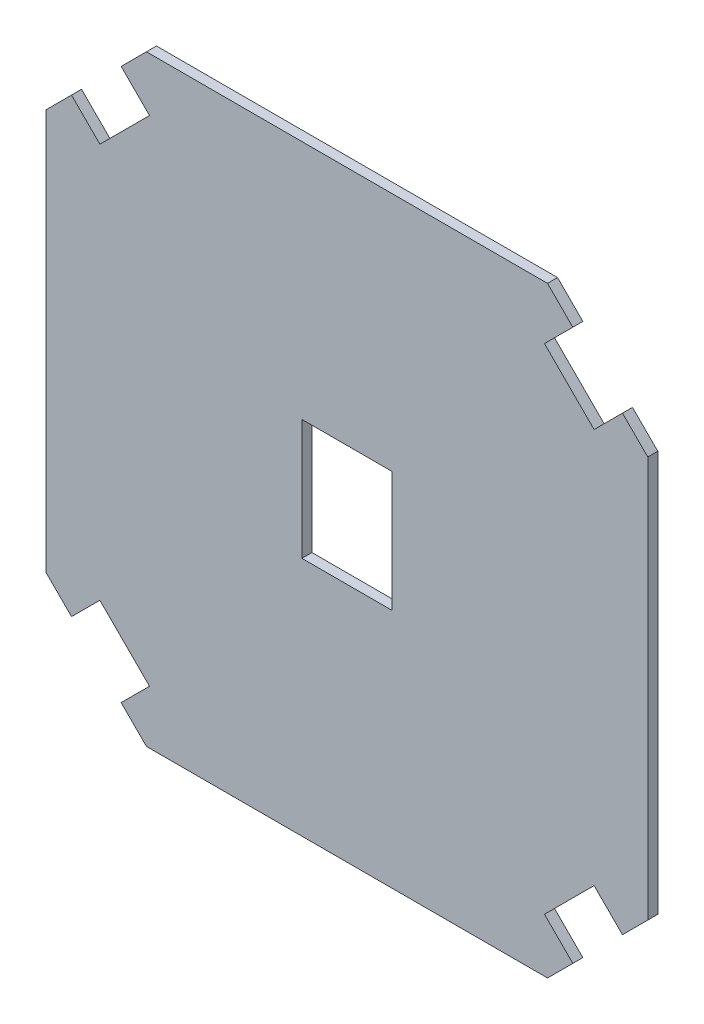
ISO-10303-21;
HEADER;
FILE_DESCRIPTION(('STEP AP214'),'2;1');
FILE_NAME('part.step','',(''),(''),'','','');
FILE_SCHEMA(('AUTOMOTIVE_DESIGN { 1 0 10303 214 1 1 1 1 }'));
ENDSEC;
DATA;
#1=APPLICATION_CONTEXT('core data for automotive mechanical design processes');
#2=APPLICATION_PROTOCOL_DEFINITION('international standard','automotive_design',2000,#1);
#3=PRODUCT_CONTEXT('',#1,'mechanical');
#4=PRODUCT('Part','Part','',(#3));
#5=PRODUCT_RELATED_PRODUCT_CATEGORY('part','',(#4));
#6=PRODUCT_DEFINITION_FORMATION('','',#4);
#7=PRODUCT_DEFINITION_CONTEXT('part definition',#1,'design');
#8=PRODUCT_DEFINITION('design','',#6,#7);
#9=PRODUCT_DEFINITION_SHAPE('','',#8);
#10=(LENGTH_UNIT() NAMED_UNIT(*) SI_UNIT(.MILLI.,.METRE.));
#11=(NAMED_UNIT(*) PLANE_ANGLE_UNIT() SI_UNIT($,.RADIAN.));
#12=(NAMED_UNIT(*) SI_UNIT($,.STERADIAN.) SOLID_ANGLE_UNIT());
#13=UNCERTAINTY_MEASURE_WITH_UNIT(LENGTH_MEASURE(1.E-05),#10,'distance_accuracy_value','');
#14=(GEOMETRIC_REPRESENTATION_CONTEXT(3) GLOBAL_UNCERTAINTY_ASSIGNED_CONTEXT((#13)) GLOBAL_UNIT_ASSIGNED_CONTEXT((#10,
#11,#12)) REPRESENTATION_CONTEXT('',''));
#15=CARTESIAN_POINT('',(0.,0.,0.));
#16=DIRECTION('',(0.,0.,1.));
#17=DIRECTION('',(1.,0.,0.));
#18=AXIS2_PLACEMENT_3D('',#15,#16,#17);
#19=CARTESIAN_POINT('',(0.,-30.,5.));
#20=DIRECTION('',(0.,-1.,0.));
#21=DIRECTION('',(1.,0.,0.));
#22=AXIS2_PLACEMENT_3D('',#19,#20,#21);
#23=PLANE('',#22);
#24=DIRECTION('',(-1.,0.,0.));
#25=VECTOR('',#24,1.);
#26=CARTESIAN_POINT('',(0.,-30.,0.));
#27=LINE('',#26,#25);
#28=CARTESIAN_POINT('',(22.5,-30.,0.));
#29=VERTEX_POINT('',#28);
#30=CARTESIAN_POINT('',(-22.5,-30.,0.));
#31=VERTEX_POINT('',#30);
#32=EDGE_CURVE('E340',#29,#31,#27,.T.);
#33=ORIENTED_EDGE('',*,*,#32,.T.);
#34=DIRECTION('',(0.,0.,-1.));
#35=VECTOR('',#34,1.);
#36=CARTESIAN_POINT('',(-22.5,-30.,5.));
#37=LINE('',#36,#35);
#38=CARTESIAN_POINT('',(-22.5,-30.,5.));
#39=VERTEX_POINT('',#38);
#40=EDGE_CURVE('E11',#39,#31,#37,.T.);
#41=ORIENTED_EDGE('',*,*,#40,.F.);
#42=DIRECTION('',(-1.,0.,0.));
#43=VECTOR('',#42,1.);
#44=CARTESIAN_POINT('',(0.,-30.,5.));
#45=LINE('',#44,#43);
#46=CARTESIAN_POINT('',(22.5,-30.,5.));
#47=VERTEX_POINT('',#46);
#48=EDGE_CURVE('E241',#47,#39,#45,.T.);
#49=ORIENTED_EDGE('',*,*,#48,.F.);
#50=DIRECTION('',(0.,0.,-1.));
#51=VECTOR('',#50,1.);
#52=CARTESIAN_POINT('',(22.5,-30.,5.));
#53=LINE('',#52,#51);
#54=EDGE_CURVE('E61',#47,#29,#53,.T.);
#55=ORIENTED_EDGE('',*,*,#54,.T.);
#56=EDGE_LOOP('',(#33,#41,#49,#55));
#57=FACE_BOUND('',#56,.T.);
#58=ADVANCED_FACE('F41',(#57),#23,.F.);
#59=CARTESIAN_POINT('',(-22.5,0.,5.));
#60=DIRECTION('',(-1.,0.,0.));
#61=DIRECTION('',(0.,0.,1.));
#62=AXIS2_PLACEMENT_3D('',#59,#60,#61);
#63=PLANE('',#62);
#64=DIRECTION('',(0.,1.,0.));
#65=VECTOR('',#64,1.);
#66=CARTESIAN_POINT('',(-22.5,0.,0.));
#67=LINE('',#66,#65);
#68=CARTESIAN_POINT('',(-22.5,30.,0.));
#69=VERTEX_POINT('',#68);
#70=EDGE_CURVE('E248',#31,#69,#67,.T.);
#71=ORIENTED_EDGE('',*,*,#70,.T.);
#72=DIRECTION('',(0.,0.,-1.));
#73=VECTOR('',#72,1.);
#74=CARTESIAN_POINT('',(-22.5,30.,5.));
#75=LINE('',#74,#73);
#76=CARTESIAN_POINT('',(-22.5,30.,5.));
#77=VERTEX_POINT('',#76);
#78=EDGE_CURVE('E52',#77,#69,#75,.T.);
#79=ORIENTED_EDGE('',*,*,#78,.F.);
#80=DIRECTION('',(0.,1.,0.));
#81=VECTOR('',#80,1.);
#82=CARTESIAN_POINT('',(-22.5,0.,5.));
#83=LINE('',#82,#81);
#84=EDGE_CURVE('E235',#39,#77,#83,.T.);
#85=ORIENTED_EDGE('',*,*,#84,.F.);
#86=ORIENTED_EDGE('',*,*,#40,.T.);
#87=EDGE_LOOP('',(#71,#79,#85,#86));
#88=FACE_BOUND('',#87,.T.);
#89=ADVANCED_FACE('F247',(#88),#63,.F.);
#90=CARTESIAN_POINT('',(0.,30.,5.));
#91=DIRECTION('',(0.,-1.,0.));
#92=DIRECTION('',(1.,0.,0.));
#93=AXIS2_PLACEMENT_3D('',#90,#91,#92);
#94=PLANE('',#93);
#95=DIRECTION('',(-1.,0.,0.));
#96=VECTOR('',#95,1.);
#97=CARTESIAN_POINT('',(0.,30.,0.));
#98=LINE('',#97,#96);
#99=CARTESIAN_POINT('',(22.5,30.,0.));
#100=VERTEX_POINT('',#99);
#101=EDGE_CURVE('E345',#100,#69,#98,.T.);
#102=ORIENTED_EDGE('',*,*,#101,.F.);
#103=DIRECTION('',(0.,0.,-1.));
#104=VECTOR('',#103,1.);
#105=CARTESIAN_POINT('',(22.5,30.,5.));
#106=LINE('',#105,#104);
#107=CARTESIAN_POINT('',(22.5,30.,5.));
#108=VERTEX_POINT('',#107);
#109=EDGE_CURVE('E147',#108,#100,#106,.T.);
#110=ORIENTED_EDGE('',*,*,#109,.F.);
#111=DIRECTION('',(-1.,0.,0.));
#112=VECTOR('',#111,1.);
#113=CARTESIAN_POINT('',(0.,30.,5.));
#114=LINE('',#113,#112);
#115=EDGE_CURVE('E240',#108,#77,#114,.T.);
#116=ORIENTED_EDGE('',*,*,#115,.T.);
#117=ORIENTED_EDGE('',*,*,#78,.T.);
#118=EDGE_LOOP('',(#102,#110,#116,#117));
#119=FACE_BOUND('',#118,.T.);
#120=ADVANCED_FACE('F253',(#119),#94,.T.);
#121=CARTESIAN_POINT('',(110.857864376269,-110.85786437627,5.));
#122=DIRECTION('',(0.707106781186543,-0.707106781186552,0.));
#123=DIRECTION('',(0.707106781186552,0.707106781186543,0.));
#124=AXIS2_PLACEMENT_3D('',#121,#122,#123);
#125=PLANE('',#124);
#126=DIRECTION('',(-0.707106781186552,-0.707106781186543,0.));
#127=VECTOR('',#126,1.);
#128=CARTESIAN_POINT('',(110.857864376269,-110.85786437627,0.));
#129=LINE('',#128,#127);
#130=CARTESIAN_POINT('',(123.232233047034,-98.4834957055048,0.));
#131=VERTEX_POINT('',#130);
#132=CARTESIAN_POINT('',(98.4834957055044,-123.232233047034,0.));
#133=VERTEX_POINT('',#132);
#134=EDGE_CURVE('E262',#131,#133,#129,.T.);
#135=ORIENTED_EDGE('',*,*,#134,.F.);
#136=DIRECTION('',(0.,0.,-1.));
#137=VECTOR('',#136,1.);
#138=CARTESIAN_POINT('',(123.232233047034,-98.4834957055048,5.));
#139=LINE('',#138,#137);
#140=CARTESIAN_POINT('',(123.232233047034,-98.4834957055048,5.));
#141=VERTEX_POINT('',#140);
#142=EDGE_CURVE('E45',#141,#131,#139,.T.);
#143=ORIENTED_EDGE('',*,*,#142,.F.);
#144=DIRECTION('',(-0.707106781186552,-0.707106781186543,0.));
#145=VECTOR('',#144,1.);
#146=CARTESIAN_POINT('',(110.857864376269,-110.85786437627,5.));
#147=LINE('',#146,#145);
#148=CARTESIAN_POINT('',(98.4834957055044,-123.232233047034,5.));
#149=VERTEX_POINT('',#148);
#150=EDGE_CURVE('E352',#141,#149,#147,.T.);
#151=ORIENTED_EDGE('',*,*,#150,.T.);
#152=DIRECTION('',(0.,0.,-1.));
#153=VECTOR('',#152,1.);
#154=CARTESIAN_POINT('',(98.4834957055044,-123.232233047034,5.));
#155=LINE('',#154,#153);
#156=EDGE_CURVE('E258',#149,#133,#155,.T.);
#157=ORIENTED_EDGE('',*,*,#156,.T.);
#158=EDGE_LOOP('',(#135,#143,#151,#157));
#159=FACE_BOUND('',#158,.T.);
#160=ADVANCED_FACE('F43',(#159),#125,.T.);
#161=CARTESIAN_POINT('',(12.3743686707649,12.3743686707648,5.));
#162=DIRECTION('',(-0.70710678118655,-0.707106781186545,0.));
#163=DIRECTION('',(0.707106781186545,-0.70710678118655,0.));
#164=AXIS2_PLACEMENT_3D('',#161,#162,#163);
#165=PLANE('',#164);
#166=DIRECTION('',(-0.707106781186545,0.70710678118655,0.));
#167=VECTOR('',#166,1.);
#168=CARTESIAN_POINT('',(12.3743686707649,12.3743686707648,0.));
#169=LINE('',#168,#167);
#170=CARTESIAN_POINT('',(137.374368670765,-112.625631329236,0.));
#171=VERTEX_POINT('',#170);
#172=EDGE_CURVE('E266',#171,#131,#169,.T.);
#173=ORIENTED_EDGE('',*,*,#172,.F.);
#174=DIRECTION('',(0.,0.,-1.));
#175=VECTOR('',#174,1.);
#176=CARTESIAN_POINT('',(137.374368670765,-112.625631329236,5.));
#177=LINE('',#176,#175);
#178=CARTESIAN_POINT('',(137.374368670765,-112.625631329236,5.));
#179=VERTEX_POINT('',#178);
#180=EDGE_CURVE('E427',#179,#171,#177,.T.);
#181=ORIENTED_EDGE('',*,*,#180,.F.);
#182=DIRECTION('',(-0.707106781186545,0.70710678118655,0.));
#183=VECTOR('',#182,1.);
#184=CARTESIAN_POINT('',(12.3743686707649,12.3743686707648,5.));
#185=LINE('',#184,#183);
#186=EDGE_CURVE('E438',#179,#141,#185,.T.);
#187=ORIENTED_EDGE('',*,*,#186,.T.);
#188=ORIENTED_EDGE('',*,*,#142,.T.);
#189=EDGE_LOOP('',(#173,#181,#187,#188));
#190=FACE_BOUND('',#189,.T.);
#191=ADVANCED_FACE('F436',(#190),#165,.T.);
#192=CARTESIAN_POINT('',(124.999999999999,-125.000000000001,5.));
#193=DIRECTION('',(-0.707106781186544,0.707106781186552,0.));
#194=DIRECTION('',(-0.707106781186551,-0.707106781186544,0.));
#195=AXIS2_PLACEMENT_3D('',#192,#193,#194);
#196=PLANE('',#195);
#197=DIRECTION('',(0.707106781186552,0.707106781186544,0.));
#198=VECTOR('',#197,1.);
#199=CARTESIAN_POINT('',(124.999999999999,-125.000000000001,0.));
#200=LINE('',#199,#198);
#201=CARTESIAN_POINT('',(150.,-100.000000000001,0.));
#202=VERTEX_POINT('',#201);
#203=EDGE_CURVE('E270',#171,#202,#200,.T.);
#204=ORIENTED_EDGE('',*,*,#203,.T.);
#205=DIRECTION('',(0.,0.,-1.));
#206=VECTOR('',#205,1.);
#207=CARTESIAN_POINT('',(150.,-100.000000000001,5.));
#208=LINE('',#207,#206);
#209=CARTESIAN_POINT('',(150.,-100.000000000001,5.));
#210=VERTEX_POINT('',#209);
#211=EDGE_CURVE('E424',#210,#202,#208,.T.);
#212=ORIENTED_EDGE('',*,*,#211,.F.);
#213=DIRECTION('',(0.707106781186552,0.707106781186544,0.));
#214=VECTOR('',#213,1.);
#215=CARTESIAN_POINT('',(124.999999999999,-125.000000000001,5.));
#216=LINE('',#215,#214);
#217=EDGE_CURVE('E456',#179,#210,#216,.T.);
#218=ORIENTED_EDGE('',*,*,#217,.F.);
#219=ORIENTED_EDGE('',*,*,#180,.T.);
#220=EDGE_LOOP('',(#204,#212,#218,#219));
#221=FACE_BOUND('',#220,.T.);
#222=ADVANCED_FACE('F445',(#221),#196,.F.);
#223=CARTESIAN_POINT('',(150.,0.,5.));
#224=DIRECTION('',(-1.,0.,0.));
#225=DIRECTION('',(0.,0.,1.));
#226=AXIS2_PLACEMENT_3D('',#223,#224,#225);
#227=PLANE('',#226);
#228=DIRECTION('',(0.,1.,0.));
#229=VECTOR('',#228,1.);
#230=CARTESIAN_POINT('',(150.,0.,0.));
#231=LINE('',#230,#229);
#232=CARTESIAN_POINT('',(150.,100.000000000001,0.));
#233=VERTEX_POINT('',#232);
#234=EDGE_CURVE('E273',#202,#233,#231,.T.);
#235=ORIENTED_EDGE('',*,*,#234,.T.);
#236=DIRECTION('',(0.,0.,-1.));
#237=VECTOR('',#236,1.);
#238=CARTESIAN_POINT('',(150.,100.000000000001,5.));
#239=LINE('',#238,#237);
#240=CARTESIAN_POINT('',(150.,100.000000000001,5.));
#241=VERTEX_POINT('',#240);
#242=EDGE_CURVE('E421',#241,#233,#239,.T.);
#243=ORIENTED_EDGE('',*,*,#242,.F.);
#244=DIRECTION('',(0.,1.,0.));
#245=VECTOR('',#244,1.);
#246=CARTESIAN_POINT('',(150.,0.,5.));
#247=LINE('',#246,#245);
#248=EDGE_CURVE('E450',#210,#241,#247,.T.);
#249=ORIENTED_EDGE('',*,*,#248,.F.);
#250=ORIENTED_EDGE('',*,*,#211,.T.);
#251=EDGE_LOOP('',(#235,#243,#249,#250));
#252=FACE_BOUND('',#251,.T.);
#253=ADVANCED_FACE('F448',(#252),#227,.F.);
#254=CARTESIAN_POINT('',(124.999999999999,125.000000000001,5.));
#255=DIRECTION('',(0.707106781186544,0.707106781186552,0.));
#256=DIRECTION('',(-0.707106781186551,0.707106781186544,0.));
#257=AXIS2_PLACEMENT_3D('',#254,#255,#256);
#258=PLANE('',#257);
#259=DIRECTION('',(0.707106781186552,-0.707106781186544,0.));
#260=VECTOR('',#259,1.);
#261=CARTESIAN_POINT('',(124.999999999999,125.000000000001,0.));
#262=LINE('',#261,#260);
#263=CARTESIAN_POINT('',(137.374368670765,112.625631329236,0.));
#264=VERTEX_POINT('',#263);
#265=EDGE_CURVE('E278',#264,#233,#262,.T.);
#266=ORIENTED_EDGE('',*,*,#265,.F.);
#267=DIRECTION('',(0.,0.,-1.));
#268=VECTOR('',#267,1.);
#269=CARTESIAN_POINT('',(137.374368670765,112.625631329236,5.));
#270=LINE('',#269,#268);
#271=CARTESIAN_POINT('',(137.374368670765,112.625631329236,5.));
#272=VERTEX_POINT('',#271);
#273=EDGE_CURVE('E418',#272,#264,#270,.T.);
#274=ORIENTED_EDGE('',*,*,#273,.F.);
#275=DIRECTION('',(0.707106781186552,-0.707106781186544,0.));
#276=VECTOR('',#275,1.);
#277=CARTESIAN_POINT('',(124.999999999999,125.000000000001,5.));
#278=LINE('',#277,#276);
#279=EDGE_CURVE('E455',#272,#241,#278,.T.);
#280=ORIENTED_EDGE('',*,*,#279,.T.);
#281=ORIENTED_EDGE('',*,*,#242,.T.);
#282=EDGE_LOOP('',(#266,#274,#280,#281));
#283=FACE_BOUND('',#282,.T.);
#284=ADVANCED_FACE('F622',(#283),#258,.T.);
#285=CARTESIAN_POINT('',(12.3743686707649,-12.3743686707648,5.));
#286=DIRECTION('',(0.70710678118655,-0.707106781186545,0.));
#287=DIRECTION('',(0.707106781186545,0.70710678118655,0.));
#288=AXIS2_PLACEMENT_3D('',#285,#286,#287);
#289=PLANE('',#288);
#290=DIRECTION('',(-0.707106781186545,-0.70710678118655,0.));
#291=VECTOR('',#290,1.);
#292=CARTESIAN_POINT('',(12.3743686707649,-12.3743686707648,0.));
#293=LINE('',#292,#291);
#294=CARTESIAN_POINT('',(123.232233047034,98.4834957055048,0.));
#295=VERTEX_POINT('',#294);
#296=EDGE_CURVE('E282',#264,#295,#293,.T.);
#297=ORIENTED_EDGE('',*,*,#296,.T.);
#298=DIRECTION('',(0.,0.,-1.));
#299=VECTOR('',#298,1.);
#300=CARTESIAN_POINT('',(123.232233047034,98.4834957055048,5.));
#301=LINE('',#300,#299);
#302=CARTESIAN_POINT('',(123.232233047034,98.4834957055048,5.));
#303=VERTEX_POINT('',#302);
#304=EDGE_CURVE('E414',#303,#295,#301,.T.);
#305=ORIENTED_EDGE('',*,*,#304,.F.);
#306=DIRECTION('',(-0.707106781186545,-0.70710678118655,0.));
#307=VECTOR('',#306,1.);
#308=CARTESIAN_POINT('',(12.3743686707649,-12.3743686707648,5.));
#309=LINE('',#308,#307);
#310=EDGE_CURVE('E460',#272,#303,#309,.T.);
#311=ORIENTED_EDGE('',*,*,#310,.F.);
#312=ORIENTED_EDGE('',*,*,#273,.T.);
#313=EDGE_LOOP('',(#297,#305,#311,#312));
#314=FACE_BOUND('',#313,.T.);
#315=ADVANCED_FACE('F787',(#314),#289,.F.);
#316=CARTESIAN_POINT('',(110.857864376269,110.85786437627,5.));
#317=DIRECTION('',(-0.707106781186543,-0.707106781186552,0.));
#318=DIRECTION('',(0.707106781186552,-0.707106781186543,0.));
#319=AXIS2_PLACEMENT_3D('',#316,#317,#318);
#320=PLANE('',#319);
#321=DIRECTION('',(-0.707106781186552,0.707106781186543,0.));
#322=VECTOR('',#321,1.);
#323=CARTESIAN_POINT('',(110.857864376269,110.85786437627,0.));
#324=LINE('',#323,#322);
#325=CARTESIAN_POINT('',(98.4834957055045,123.232233047034,0.));
#326=VERTEX_POINT('',#325);
#327=EDGE_CURVE('E286',#295,#326,#324,.T.);
#328=ORIENTED_EDGE('',*,*,#327,.T.);
#329=DIRECTION('',(0.,0.,-1.));
#330=VECTOR('',#329,1.);
#331=CARTESIAN_POINT('',(98.4834957055045,123.232233047034,5.));
#332=LINE('',#331,#330);
#333=CARTESIAN_POINT('',(98.4834957055045,123.232233047034,5.));
#334=VERTEX_POINT('',#333);
#335=EDGE_CURVE('E410',#334,#326,#332,.T.);
#336=ORIENTED_EDGE('',*,*,#335,.F.);
#337=DIRECTION('',(-0.707106781186552,0.707106781186543,0.));
#338=VECTOR('',#337,1.);
#339=CARTESIAN_POINT('',(110.857864376269,110.85786437627,5.));
#340=LINE('',#339,#338);
#341=EDGE_CURVE('E469',#303,#334,#340,.T.);
#342=ORIENTED_EDGE('',*,*,#341,.F.);
#343=ORIENTED_EDGE('',*,*,#304,.T.);
#344=EDGE_LOOP('',(#328,#336,#342,#343));
#345=FACE_BOUND('',#344,.T.);
#346=ADVANCED_FACE('F779',(#345),#320,.F.);
#347=CARTESIAN_POINT('',(-12.3743686707643,12.3743686707642,5.));
#348=DIRECTION('',(-0.707106781186551,0.707106781186544,0.));
#349=DIRECTION('',(-0.707106781186544,-0.707106781186551,0.));
#350=AXIS2_PLACEMENT_3D('',#347,#348,#349);
#351=PLANE('',#350);
#352=DIRECTION('',(0.707106781186544,0.707106781186551,0.));
#353=VECTOR('',#352,1.);
#354=CARTESIAN_POINT('',(-12.3743686707643,12.3743686707642,0.));
#355=LINE('',#354,#353);
#356=CARTESIAN_POINT('',(112.625631329235,137.374368670765,0.));
#357=VERTEX_POINT('',#356);
#358=EDGE_CURVE('E289',#326,#357,#355,.T.);
#359=ORIENTED_EDGE('',*,*,#358,.T.);
#360=DIRECTION('',(0.,0.,-1.));
#361=VECTOR('',#360,1.);
#362=CARTESIAN_POINT('',(112.625631329235,137.374368670765,5.));
#363=LINE('',#362,#361);
#364=CARTESIAN_POINT('',(112.625631329235,137.374368670765,5.));
#365=VERTEX_POINT('',#364);
#366=EDGE_CURVE('E407',#365,#357,#363,.T.);
#367=ORIENTED_EDGE('',*,*,#366,.F.);
#368=DIRECTION('',(0.707106781186544,0.707106781186551,0.));
#369=VECTOR('',#368,1.);
#370=CARTESIAN_POINT('',(-12.3743686707643,12.3743686707642,5.));
#371=LINE('',#370,#369);
#372=EDGE_CURVE('E472',#334,#365,#371,.T.);
#373=ORIENTED_EDGE('',*,*,#372,.F.);
#374=ORIENTED_EDGE('',*,*,#335,.T.);
#375=EDGE_LOOP('',(#359,#367,#373,#374));
#376=FACE_BOUND('',#375,.T.);
#377=ADVANCED_FACE('F537',(#376),#351,.F.);
#378=CARTESIAN_POINT('',(100.,150.,0.));
#379=VERTEX_POINT('',#378);
#380=EDGE_CURVE('E283',#379,#357,#262,.T.);
#381=ORIENTED_EDGE('',*,*,#380,.F.);
#382=DIRECTION('',(0.,0.,-1.));
#383=VECTOR('',#382,1.);
#384=CARTESIAN_POINT('',(100.,150.,5.));
#385=LINE('',#384,#383);
#386=CARTESIAN_POINT('',(100.,150.,5.));
#387=VERTEX_POINT('',#386);
#388=EDGE_CURVE('E404',#387,#379,#385,.T.);
#389=ORIENTED_EDGE('',*,*,#388,.F.);
#390=EDGE_CURVE('E462',#387,#365,#278,.T.);
#391=ORIENTED_EDGE('',*,*,#390,.T.);
#392=ORIENTED_EDGE('',*,*,#366,.T.);
#393=EDGE_LOOP('',(#381,#389,#391,#392));
#394=FACE_BOUND('',#393,.T.);
#395=ADVANCED_FACE('F529',(#394),#258,.T.);
#396=CARTESIAN_POINT('',(0.,150.,5.));
#397=DIRECTION('',(0.,-1.,0.));
#398=DIRECTION('',(1.,0.,0.));
#399=AXIS2_PLACEMENT_3D('',#396,#397,#398);
#400=PLANE('',#399);
#401=DIRECTION('',(-1.,0.,0.));
#402=VECTOR('',#401,1.);
#403=CARTESIAN_POINT('',(0.,150.,0.));
#404=LINE('',#403,#402);
#405=CARTESIAN_POINT('',(-100.,150.,0.));
#406=VERTEX_POINT('',#405);
#407=EDGE_CURVE('E293',#379,#406,#404,.T.);
#408=ORIENTED_EDGE('',*,*,#407,.T.);
#409=DIRECTION('',(0.,0.,-1.));
#410=VECTOR('',#409,1.);
#411=CARTESIAN_POINT('',(-100.,150.,5.));
#412=LINE('',#411,#410);
#413=CARTESIAN_POINT('',(-100.,150.,5.));
#414=VERTEX_POINT('',#413);
#415=EDGE_CURVE('E400',#414,#406,#412,.T.);
#416=ORIENTED_EDGE('',*,*,#415,.F.);
#417=DIRECTION('',(-1.,0.,0.));
#418=VECTOR('',#417,1.);
#419=CARTESIAN_POINT('',(0.,150.,5.));
#420=LINE('',#419,#418);
#421=EDGE_CURVE('E475',#387,#414,#420,.T.);
#422=ORIENTED_EDGE('',*,*,#421,.F.);
#423=ORIENTED_EDGE('',*,*,#388,.T.);
#424=EDGE_LOOP('',(#408,#416,#422,#423));
#425=FACE_BOUND('',#424,.T.);
#426=ADVANCED_FACE('F612',(#425),#400,.F.);
#427=CARTESIAN_POINT('',(-124.999999999999,125.000000000001,5.));
#428=DIRECTION('',(0.707106781186543,-0.707106781186552,0.));
#429=DIRECTION('',(0.707106781186552,0.707106781186543,0.));
#430=AXIS2_PLACEMENT_3D('',#427,#428,#429);
#431=PLANE('',#430);
#432=DIRECTION('',(-0.707106781186552,-0.707106781186543,0.));
#433=VECTOR('',#432,1.);
#434=CARTESIAN_POINT('',(-124.999999999999,125.000000000001,0.));
#435=LINE('',#434,#433);
#436=CARTESIAN_POINT('',(-112.625631329235,137.374368670765,0.));
#437=VERTEX_POINT('',#436);
#438=EDGE_CURVE('E296',#406,#437,#435,.T.);
#439=ORIENTED_EDGE('',*,*,#438,.T.);
#440=DIRECTION('',(0.,0.,-1.));
#441=VECTOR('',#440,1.);
#442=CARTESIAN_POINT('',(-112.625631329235,137.374368670765,5.));
#443=LINE('',#442,#441);
#444=CARTESIAN_POINT('',(-112.625631329235,137.374368670765,5.));
#445=VERTEX_POINT('',#444);
#446=EDGE_CURVE('E397',#445,#437,#443,.T.);
#447=ORIENTED_EDGE('',*,*,#446,.F.);
#448=DIRECTION('',(-0.707106781186552,-0.707106781186543,0.));
#449=VECTOR('',#448,1.);
#450=CARTESIAN_POINT('',(-124.999999999999,125.000000000001,5.));
#451=LINE('',#450,#449);
#452=EDGE_CURVE('E478',#414,#445,#451,.T.);
#453=ORIENTED_EDGE('',*,*,#452,.F.);
#454=ORIENTED_EDGE('',*,*,#415,.T.);
#455=EDGE_LOOP('',(#439,#447,#453,#454));
#456=FACE_BOUND('',#455,.T.);
#457=ADVANCED_FACE('F610',(#456),#431,.F.);
#458=CARTESIAN_POINT('',(12.3743686707643,12.3743686707642,5.));
#459=DIRECTION('',(-0.707106781186551,-0.707106781186544,0.));
#460=DIRECTION('',(0.707106781186544,-0.707106781186551,0.));
#461=AXIS2_PLACEMENT_3D('',#458,#459,#460);
#462=PLANE('',#461);
#463=DIRECTION('',(-0.707106781186544,0.707106781186551,0.));
#464=VECTOR('',#463,1.);
#465=CARTESIAN_POINT('',(12.3743686707643,12.3743686707642,0.));
#466=LINE('',#465,#464);
#467=CARTESIAN_POINT('',(-98.4834957055044,123.232233047034,0.));
#468=VERTEX_POINT('',#467);
#469=EDGE_CURVE('E300',#468,#437,#466,.T.);
#470=ORIENTED_EDGE('',*,*,#469,.F.);
#471=DIRECTION('',(0.,0.,-1.));
#472=VECTOR('',#471,1.);
#473=CARTESIAN_POINT('',(-98.4834957055044,123.232233047034,5.));
#474=LINE('',#473,#472);
#475=CARTESIAN_POINT('',(-98.4834957055044,123.232233047034,5.));
#476=VERTEX_POINT('',#475);
#477=EDGE_CURVE('E394',#476,#468,#474,.T.);
#478=ORIENTED_EDGE('',*,*,#477,.F.);
#479=DIRECTION('',(-0.707106781186544,0.707106781186551,0.));
#480=VECTOR('',#479,1.);
#481=CARTESIAN_POINT('',(12.3743686707643,12.3743686707642,5.));
#482=LINE('',#481,#480);
#483=EDGE_CURVE('E481',#476,#445,#482,.T.);
#484=ORIENTED_EDGE('',*,*,#483,.T.);
#485=ORIENTED_EDGE('',*,*,#446,.T.);
#486=EDGE_LOOP('',(#470,#478,#484,#485));
#487=FACE_BOUND('',#486,.T.);
#488=ADVANCED_FACE('F605',(#487),#462,.T.);
#489=CARTESIAN_POINT('',(-110.857864376268,110.85786437627,5.));
#490=DIRECTION('',(-0.70710678118654,0.707106781186555,0.));
#491=DIRECTION('',(-0.707106781186555,-0.70710678118654,0.));
#492=AXIS2_PLACEMENT_3D('',#489,#490,#491);
#493=PLANE('',#492);
#494=DIRECTION('',(0.707106781186555,0.70710678118654,0.));
#495=VECTOR('',#494,1.);
#496=CARTESIAN_POINT('',(-110.857864376268,110.85786437627,0.));
#497=LINE('',#496,#495);
#498=CARTESIAN_POINT('',(-123.232233047032,98.4834957055067,0.));
#499=VERTEX_POINT('',#498);
#500=EDGE_CURVE('E305',#499,#468,#497,.T.);
#501=ORIENTED_EDGE('',*,*,#500,.F.);
#502=DIRECTION('',(0.,0.,-1.));
#503=VECTOR('',#502,1.);
#504=CARTESIAN_POINT('',(-123.232233047032,98.4834957055067,5.));
#505=LINE('',#504,#503);
#506=CARTESIAN_POINT('',(-123.232233047032,98.4834957055067,5.));
#507=VERTEX_POINT('',#506);
#508=EDGE_CURVE('E391',#507,#499,#505,.T.);
#509=ORIENTED_EDGE('',*,*,#508,.F.);
#510=DIRECTION('',(0.707106781186555,0.70710678118654,0.));
#511=VECTOR('',#510,1.);
#512=CARTESIAN_POINT('',(-110.857864376268,110.85786437627,5.));
#513=LINE('',#512,#511);
#514=EDGE_CURVE('E486',#507,#476,#513,.T.);
#515=ORIENTED_EDGE('',*,*,#514,.T.);
#516=ORIENTED_EDGE('',*,*,#477,.T.);
#517=EDGE_LOOP('',(#501,#509,#515,#516));
#518=FACE_BOUND('',#517,.T.);
#519=ADVANCED_FACE('F602',(#518),#493,.T.);
#520=CARTESIAN_POINT('',(-12.3743686707635,-12.3743686707634,5.));
#521=DIRECTION('',(0.707106781186552,0.707106781186543,0.));
#522=DIRECTION('',(-0.707106781186543,0.707106781186552,0.));
#523=AXIS2_PLACEMENT_3D('',#520,#521,#522);
#524=PLANE('',#523);
#525=DIRECTION('',(0.707106781186543,-0.707106781186552,0.));
#526=VECTOR('',#525,1.);
#527=CARTESIAN_POINT('',(-12.3743686707635,-12.3743686707634,0.));
#528=LINE('',#527,#526);
#529=CARTESIAN_POINT('',(-137.374368670763,112.625631329238,0.));
#530=VERTEX_POINT('',#529);
#531=EDGE_CURVE('E309',#530,#499,#528,.T.);
#532=ORIENTED_EDGE('',*,*,#531,.F.);
#533=DIRECTION('',(0.,0.,-1.));
#534=VECTOR('',#533,1.);
#535=CARTESIAN_POINT('',(-137.374368670763,112.625631329238,5.));
#536=LINE('',#535,#534);
#537=CARTESIAN_POINT('',(-137.374368670763,112.625631329238,5.));
#538=VERTEX_POINT('',#537);
#539=EDGE_CURVE('E388',#538,#530,#536,.T.);
#540=ORIENTED_EDGE('',*,*,#539,.F.);
#541=DIRECTION('',(0.707106781186543,-0.707106781186552,0.));
#542=VECTOR('',#541,1.);
#543=CARTESIAN_POINT('',(-12.3743686707635,-12.3743686707634,5.));
#544=LINE('',#543,#542);
#545=EDGE_CURVE('E490',#538,#507,#544,.T.);
#546=ORIENTED_EDGE('',*,*,#545,.T.);
#547=ORIENTED_EDGE('',*,*,#508,.T.);
#548=EDGE_LOOP('',(#532,#540,#546,#547));
#549=FACE_BOUND('',#548,.T.);
#550=ADVANCED_FACE('F596',(#549),#524,.T.);
#551=CARTESIAN_POINT('',(-150.,100.000000000001,0.));
#552=VERTEX_POINT('',#551);
#553=EDGE_CURVE('E301',#530,#552,#435,.T.);
#554=ORIENTED_EDGE('',*,*,#553,.T.);
#555=DIRECTION('',(0.,0.,-1.));
#556=VECTOR('',#555,1.);
#557=CARTESIAN_POINT('',(-150.,100.000000000001,5.));
#558=LINE('',#557,#556);
#559=CARTESIAN_POINT('',(-150.,100.000000000001,5.));
#560=VERTEX_POINT('',#559);
#561=EDGE_CURVE('E385',#560,#552,#558,.T.);
#562=ORIENTED_EDGE('',*,*,#561,.F.);
#563=EDGE_CURVE('E482',#538,#560,#451,.T.);
#564=ORIENTED_EDGE('',*,*,#563,.F.);
#565=ORIENTED_EDGE('',*,*,#539,.T.);
#566=EDGE_LOOP('',(#554,#562,#564,#565));
#567=FACE_BOUND('',#566,.T.);
#568=ADVANCED_FACE('F620',(#567),#431,.F.);
#569=CARTESIAN_POINT('',(-150.,0.,5.));
#570=DIRECTION('',(-1.,0.,0.));
#571=DIRECTION('',(0.,0.,1.));
#572=AXIS2_PLACEMENT_3D('',#569,#570,#571);
#573=PLANE('',#572);
#574=DIRECTION('',(0.,1.,0.));
#575=VECTOR('',#574,1.);
#576=CARTESIAN_POINT('',(-150.,0.,0.));
#577=LINE('',#576,#575);
#578=CARTESIAN_POINT('',(-150.,-100.000000000001,0.));
#579=VERTEX_POINT('',#578);
#580=EDGE_CURVE('E313',#579,#552,#577,.T.);
#581=ORIENTED_EDGE('',*,*,#580,.F.);
#582=DIRECTION('',(0.,0.,-1.));
#583=VECTOR('',#582,1.);
#584=CARTESIAN_POINT('',(-150.,-100.000000000001,5.));
#585=LINE('',#584,#583);
#586=CARTESIAN_POINT('',(-150.,-100.000000000001,5.));
#587=VERTEX_POINT('',#586);
#588=EDGE_CURVE('E382',#587,#579,#585,.T.);
#589=ORIENTED_EDGE('',*,*,#588,.F.);
#590=DIRECTION('',(0.,1.,0.));
#591=VECTOR('',#590,1.);
#592=CARTESIAN_POINT('',(-150.,0.,5.));
#593=LINE('',#592,#591);
#594=EDGE_CURVE('E494',#587,#560,#593,.T.);
#595=ORIENTED_EDGE('',*,*,#594,.T.);
#596=ORIENTED_EDGE('',*,*,#561,.T.);
#597=EDGE_LOOP('',(#581,#589,#595,#596));
#598=FACE_BOUND('',#597,.T.);
#599=ADVANCED_FACE('F590',(#598),#573,.T.);
#600=CARTESIAN_POINT('',(-124.999999999999,-125.000000000001,5.));
#601=DIRECTION('',(-0.707106781186543,-0.707106781186552,0.));
#602=DIRECTION('',(0.707106781186552,-0.707106781186543,0.));
#603=AXIS2_PLACEMENT_3D('',#600,#601,#602);
#604=PLANE('',#603);
#605=DIRECTION('',(-0.707106781186552,0.707106781186543,0.));
#606=VECTOR('',#605,1.);
#607=CARTESIAN_POINT('',(-124.999999999999,-125.000000000001,0.));
#608=LINE('',#607,#606);
#609=CARTESIAN_POINT('',(-137.374368670765,-112.625631329236,0.));
#610=VERTEX_POINT('',#609);
#611=EDGE_CURVE('E317',#610,#579,#608,.T.);
#612=ORIENTED_EDGE('',*,*,#611,.F.);
#613=DIRECTION('',(0.,0.,-1.));
#614=VECTOR('',#613,1.);
#615=CARTESIAN_POINT('',(-137.374368670765,-112.625631329236,5.));
#616=LINE('',#615,#614);
#617=CARTESIAN_POINT('',(-137.374368670765,-112.625631329236,5.));
#618=VERTEX_POINT('',#617);
#619=EDGE_CURVE('E379',#618,#610,#616,.T.);
#620=ORIENTED_EDGE('',*,*,#619,.F.);
#621=DIRECTION('',(-0.707106781186552,0.707106781186543,0.));
#622=VECTOR('',#621,1.);
#623=CARTESIAN_POINT('',(-124.999999999999,-125.000000000001,5.));
#624=LINE('',#623,#622);
#625=EDGE_CURVE('E498',#618,#587,#624,.T.);
#626=ORIENTED_EDGE('',*,*,#625,.T.);
#627=ORIENTED_EDGE('',*,*,#588,.T.);
#628=EDGE_LOOP('',(#612,#620,#626,#627));
#629=FACE_BOUND('',#628,.T.);
#630=ADVANCED_FACE('F586',(#629),#604,.T.);
#631=CARTESIAN_POINT('',(-12.3743686707644,12.3743686707644,5.));
#632=DIRECTION('',(-0.707106781186547,0.707106781186548,0.));
#633=DIRECTION('',(-0.707106781186548,-0.707106781186547,0.));
#634=AXIS2_PLACEMENT_3D('',#631,#632,#633);
#635=PLANE('',#634);
#636=DIRECTION('',(0.707106781186548,0.707106781186547,0.));
#637=VECTOR('',#636,1.);
#638=CARTESIAN_POINT('',(-12.3743686707644,12.3743686707644,0.));
#639=LINE('',#638,#637);
#640=CARTESIAN_POINT('',(-123.232233047034,-98.4834957055048,0.));
#641=VERTEX_POINT('',#640);
#642=EDGE_CURVE('E321',#610,#641,#639,.T.);
#643=ORIENTED_EDGE('',*,*,#642,.T.);
#644=DIRECTION('',(0.,0.,-1.));
#645=VECTOR('',#644,1.);
#646=CARTESIAN_POINT('',(-123.232233047034,-98.4834957055048,5.));
#647=LINE('',#646,#645);
#648=CARTESIAN_POINT('',(-123.232233047034,-98.4834957055048,5.));
#649=VERTEX_POINT('',#648);
#650=EDGE_CURVE('E375',#649,#641,#647,.T.);
#651=ORIENTED_EDGE('',*,*,#650,.F.);
#652=DIRECTION('',(0.707106781186548,0.707106781186547,0.));
#653=VECTOR('',#652,1.);
#654=CARTESIAN_POINT('',(-12.3743686707644,12.3743686707644,5.));
#655=LINE('',#654,#653);
#656=EDGE_CURVE('E502',#618,#649,#655,.T.);
#657=ORIENTED_EDGE('',*,*,#656,.F.);
#658=ORIENTED_EDGE('',*,*,#619,.T.);
#659=EDGE_LOOP('',(#643,#651,#657,#658));
#660=FACE_BOUND('',#659,.T.);
#661=ADVANCED_FACE('F582',(#660),#635,.F.);
#662=CARTESIAN_POINT('',(-110.857864376269,-110.85786437627,5.));
#663=DIRECTION('',(0.707106781186544,0.707106781186551,0.));
#664=DIRECTION('',(-0.707106781186551,0.707106781186544,0.));
#665=AXIS2_PLACEMENT_3D('',#662,#663,#664);
#666=PLANE('',#665);
#667=DIRECTION('',(0.707106781186551,-0.707106781186544,0.));
#668=VECTOR('',#667,1.);
#669=CARTESIAN_POINT('',(-110.857864376269,-110.85786437627,0.));
#670=LINE('',#669,#668);
#671=CARTESIAN_POINT('',(-98.4834957055044,-123.232233047034,0.));
#672=VERTEX_POINT('',#671);
#673=EDGE_CURVE('E325',#641,#672,#670,.T.);
#674=ORIENTED_EDGE('',*,*,#673,.T.);
#675=DIRECTION('',(0.,0.,-1.));
#676=VECTOR('',#675,1.);
#677=CARTESIAN_POINT('',(-98.4834957055044,-123.232233047034,5.));
#678=LINE('',#677,#676);
#679=CARTESIAN_POINT('',(-98.4834957055044,-123.232233047034,5.));
#680=VERTEX_POINT('',#679);
#681=EDGE_CURVE('E371',#680,#672,#678,.T.);
#682=ORIENTED_EDGE('',*,*,#681,.F.);
#683=DIRECTION('',(0.707106781186551,-0.707106781186544,0.));
#684=VECTOR('',#683,1.);
#685=CARTESIAN_POINT('',(-110.857864376269,-110.85786437627,5.));
#686=LINE('',#685,#684);
#687=EDGE_CURVE('E506',#649,#680,#686,.T.);
#688=ORIENTED_EDGE('',*,*,#687,.F.);
#689=ORIENTED_EDGE('',*,*,#650,.T.);
#690=EDGE_LOOP('',(#674,#682,#688,#689));
#691=FACE_BOUND('',#690,.T.);
#692=ADVANCED_FACE('F578',(#691),#666,.F.);
#693=CARTESIAN_POINT('',(12.3743686707643,-12.3743686707642,5.));
#694=DIRECTION('',(0.707106781186551,-0.707106781186544,0.));
#695=DIRECTION('',(0.707106781186544,0.707106781186551,0.));
#696=AXIS2_PLACEMENT_3D('',#693,#694,#695);
#697=PLANE('',#696);
#698=DIRECTION('',(-0.707106781186544,-0.707106781186551,0.));
#699=VECTOR('',#698,1.);
#700=CARTESIAN_POINT('',(12.3743686707643,-12.3743686707642,0.));
#701=LINE('',#700,#699);
#702=CARTESIAN_POINT('',(-112.625631329235,-137.374368670765,0.));
#703=VERTEX_POINT('',#702);
#704=EDGE_CURVE('E328',#672,#703,#701,.T.);
#705=ORIENTED_EDGE('',*,*,#704,.T.);
#706=DIRECTION('',(0.,0.,-1.));
#707=VECTOR('',#706,1.);
#708=CARTESIAN_POINT('',(-112.625631329235,-137.374368670765,5.));
#709=LINE('',#708,#707);
#710=CARTESIAN_POINT('',(-112.625631329235,-137.374368670765,5.));
#711=VERTEX_POINT('',#710);
#712=EDGE_CURVE('E368',#711,#703,#709,.T.);
#713=ORIENTED_EDGE('',*,*,#712,.F.);
#714=DIRECTION('',(-0.707106781186544,-0.707106781186551,0.));
#715=VECTOR('',#714,1.);
#716=CARTESIAN_POINT('',(12.3743686707643,-12.3743686707642,5.));
#717=LINE('',#716,#715);
#718=EDGE_CURVE('E509',#680,#711,#717,.T.);
#719=ORIENTED_EDGE('',*,*,#718,.F.);
#720=ORIENTED_EDGE('',*,*,#681,.T.);
#721=EDGE_LOOP('',(#705,#713,#719,#720));
#722=FACE_BOUND('',#721,.T.);
#723=ADVANCED_FACE('F573',(#722),#697,.F.);
#724=CARTESIAN_POINT('',(-100.,-150.,0.));
#725=VERTEX_POINT('',#724);
#726=EDGE_CURVE('E322',#725,#703,#608,.T.);
#727=ORIENTED_EDGE('',*,*,#726,.F.);
#728=DIRECTION('',(0.,0.,-1.));
#729=VECTOR('',#728,1.);
#730=CARTESIAN_POINT('',(-100.,-150.,5.));
#731=LINE('',#730,#729);
#732=CARTESIAN_POINT('',(-100.,-150.,5.));
#733=VERTEX_POINT('',#732);
#734=EDGE_CURVE('E365',#733,#725,#731,.T.);
#735=ORIENTED_EDGE('',*,*,#734,.F.);
#736=EDGE_CURVE('E503',#733,#711,#624,.T.);
#737=ORIENTED_EDGE('',*,*,#736,.T.);
#738=ORIENTED_EDGE('',*,*,#712,.T.);
#739=EDGE_LOOP('',(#727,#735,#737,#738));
#740=FACE_BOUND('',#739,.T.);
#741=ADVANCED_FACE('F567',(#740),#604,.T.);
#742=CARTESIAN_POINT('',(0.,-150.,5.));
#743=DIRECTION('',(0.,-1.,0.));
#744=DIRECTION('',(1.,0.,0.));
#745=AXIS2_PLACEMENT_3D('',#742,#743,#744);
#746=PLANE('',#745);
#747=DIRECTION('',(-1.,0.,0.));
#748=VECTOR('',#747,1.);
#749=CARTESIAN_POINT('',(0.,-150.,0.));
#750=LINE('',#749,#748);
#751=CARTESIAN_POINT('',(100.,-150.,0.));
#752=VERTEX_POINT('',#751);
#753=EDGE_CURVE('E332',#752,#725,#750,.T.);
#754=ORIENTED_EDGE('',*,*,#753,.F.);
#755=DIRECTION('',(0.,0.,-1.));
#756=VECTOR('',#755,1.);
#757=CARTESIAN_POINT('',(100.,-150.,5.));
#758=LINE('',#757,#756);
#759=CARTESIAN_POINT('',(100.,-150.,5.));
#760=VERTEX_POINT('',#759);
#761=EDGE_CURVE('E362',#760,#752,#758,.T.);
#762=ORIENTED_EDGE('',*,*,#761,.F.);
#763=DIRECTION('',(-1.,0.,0.));
#764=VECTOR('',#763,1.);
#765=CARTESIAN_POINT('',(0.,-150.,5.));
#766=LINE('',#765,#764);
#767=EDGE_CURVE('E512',#760,#733,#766,.T.);
#768=ORIENTED_EDGE('',*,*,#767,.T.);
#769=ORIENTED_EDGE('',*,*,#734,.T.);
#770=EDGE_LOOP('',(#754,#762,#768,#769));
#771=FACE_BOUND('',#770,.T.);
#772=ADVANCED_FACE('F563',(#771),#746,.T.);
#773=CARTESIAN_POINT('',(112.625631329235,-137.374368670765,0.));
#774=VERTEX_POINT('',#773);
#775=EDGE_CURVE('E274',#752,#774,#200,.T.);
#776=ORIENTED_EDGE('',*,*,#775,.T.);
#777=DIRECTION('',(0.,0.,-1.));
#778=VECTOR('',#777,1.);
#779=CARTESIAN_POINT('',(112.625631329235,-137.374368670765,5.));
#780=LINE('',#779,#778);
#781=CARTESIAN_POINT('',(112.625631329235,-137.374368670765,5.));
#782=VERTEX_POINT('',#781);
#783=EDGE_CURVE('E359',#782,#774,#780,.T.);
#784=ORIENTED_EDGE('',*,*,#783,.F.);
#785=EDGE_CURVE('E464',#760,#782,#216,.T.);
#786=ORIENTED_EDGE('',*,*,#785,.F.);
#787=ORIENTED_EDGE('',*,*,#761,.T.);
#788=EDGE_LOOP('',(#776,#784,#786,#787));
#789=FACE_BOUND('',#788,.T.);
#790=ADVANCED_FACE('F635',(#789),#196,.F.);
#791=CARTESIAN_POINT('',(-12.3743686707643,-12.3743686707642,5.));
#792=DIRECTION('',(0.707106781186551,0.707106781186544,0.));
#793=DIRECTION('',(-0.707106781186544,0.707106781186551,0.));
#794=AXIS2_PLACEMENT_3D('',#791,#792,#793);
#795=PLANE('',#794);
#796=DIRECTION('',(0.707106781186544,-0.707106781186551,0.));
#797=VECTOR('',#796,1.);
#798=CARTESIAN_POINT('',(-12.3743686707643,-12.3743686707642,0.));
#799=LINE('',#798,#797);
#800=EDGE_CURVE('E336',#133,#774,#799,.T.);
#801=ORIENTED_EDGE('',*,*,#800,.F.);
#802=ORIENTED_EDGE('',*,*,#156,.F.);
#803=DIRECTION('',(0.707106781186544,-0.707106781186551,0.));
#804=VECTOR('',#803,1.);
#805=CARTESIAN_POINT('',(-12.3743686707643,-12.3743686707642,5.));
#806=LINE('',#805,#804);
#807=EDGE_CURVE('E516',#149,#782,#806,.T.);
#808=ORIENTED_EDGE('',*,*,#807,.T.);
#809=ORIENTED_EDGE('',*,*,#783,.T.);
#810=EDGE_LOOP('',(#801,#802,#808,#809));
#811=FACE_BOUND('',#810,.T.);
#812=ADVANCED_FACE('F558',(#811),#795,.T.);
#813=CARTESIAN_POINT('',(22.5,0.,5.));
#814=DIRECTION('',(-1.,0.,0.));
#815=DIRECTION('',(0.,0.,1.));
#816=AXIS2_PLACEMENT_3D('',#813,#814,#815);
#817=PLANE('',#816);
#818=DIRECTION('',(0.,1.,0.));
#819=VECTOR('',#818,1.);
#820=CARTESIAN_POINT('',(22.5,0.,0.));
#821=LINE('',#820,#819);
#822=EDGE_CURVE('E348',#29,#100,#821,.T.);
#823=ORIENTED_EDGE('',*,*,#822,.F.);
#824=ORIENTED_EDGE('',*,*,#54,.F.);
#825=DIRECTION('',(0.,1.,0.));
#826=VECTOR('',#825,1.);
#827=CARTESIAN_POINT('',(22.5,0.,5.));
#828=LINE('',#827,#826);
#829=EDGE_CURVE('E255',#47,#108,#828,.T.);
#830=ORIENTED_EDGE('',*,*,#829,.T.);
#831=ORIENTED_EDGE('',*,*,#109,.T.);
#832=EDGE_LOOP('',(#823,#824,#830,#831));
#833=FACE_BOUND('',#832,.T.);
#834=ADVANCED_FACE('F634',(#833),#817,.T.);
#835=CARTESIAN_POINT('',(0.,0.,5.));
#836=DIRECTION('',(0.,0.,1.));
#837=DIRECTION('',(1.,0.,0.));
#838=AXIS2_PLACEMENT_3D('',#835,#836,#837);
#839=PLANE('',#838);
#840=ORIENTED_EDGE('',*,*,#150,.F.);
#841=ORIENTED_EDGE('',*,*,#186,.F.);
#842=ORIENTED_EDGE('',*,*,#217,.T.);
#843=ORIENTED_EDGE('',*,*,#248,.T.);
#844=ORIENTED_EDGE('',*,*,#279,.F.);
#845=ORIENTED_EDGE('',*,*,#310,.T.);
#846=ORIENTED_EDGE('',*,*,#341,.T.);
#847=ORIENTED_EDGE('',*,*,#372,.T.);
#848=ORIENTED_EDGE('',*,*,#390,.F.);
#849=ORIENTED_EDGE('',*,*,#421,.T.);
#850=ORIENTED_EDGE('',*,*,#452,.T.);
#851=ORIENTED_EDGE('',*,*,#483,.F.);
#852=ORIENTED_EDGE('',*,*,#514,.F.);
#853=ORIENTED_EDGE('',*,*,#545,.F.);
#854=ORIENTED_EDGE('',*,*,#563,.T.);
#855=ORIENTED_EDGE('',*,*,#594,.F.);
#856=ORIENTED_EDGE('',*,*,#625,.F.);
#857=ORIENTED_EDGE('',*,*,#656,.T.);
#858=ORIENTED_EDGE('',*,*,#687,.T.);
#859=ORIENTED_EDGE('',*,*,#718,.T.);
#860=ORIENTED_EDGE('',*,*,#736,.F.);
#861=ORIENTED_EDGE('',*,*,#767,.F.);
#862=ORIENTED_EDGE('',*,*,#785,.T.);
#863=ORIENTED_EDGE('',*,*,#807,.F.);
#864=EDGE_LOOP('',(#840,#841,#842,#843,#844,#845,#846,#847,#848,#849,#850,#851,#852,#853,#854,
#855,#856,#857,#858,#859,#860,#861,#862,#863));
#865=FACE_BOUND('',#864,.T.);
#866=ORIENTED_EDGE('',*,*,#48,.T.);
#867=ORIENTED_EDGE('',*,*,#84,.T.);
#868=ORIENTED_EDGE('',*,*,#115,.F.);
#869=ORIENTED_EDGE('',*,*,#829,.F.);
#870=EDGE_LOOP('',(#866,#867,#868,#869));
#871=FACE_BOUND('',#870,.T.);
#872=ADVANCED_FACE('F237',(#865,#871),#839,.T.);
#873=CARTESIAN_POINT('',(0.,0.,0.));
#874=DIRECTION('',(0.,0.,1.));
#875=DIRECTION('',(1.,0.,0.));
#876=AXIS2_PLACEMENT_3D('',#873,#874,#875);
#877=PLANE('',#876);
#878=ORIENTED_EDGE('',*,*,#134,.T.);
#879=ORIENTED_EDGE('',*,*,#800,.T.);
#880=ORIENTED_EDGE('',*,*,#775,.F.);
#881=ORIENTED_EDGE('',*,*,#753,.T.);
#882=ORIENTED_EDGE('',*,*,#726,.T.);
#883=ORIENTED_EDGE('',*,*,#704,.F.);
#884=ORIENTED_EDGE('',*,*,#673,.F.);
#885=ORIENTED_EDGE('',*,*,#642,.F.);
#886=ORIENTED_EDGE('',*,*,#611,.T.);
#887=ORIENTED_EDGE('',*,*,#580,.T.);
#888=ORIENTED_EDGE('',*,*,#553,.F.);
#889=ORIENTED_EDGE('',*,*,#531,.T.);
#890=ORIENTED_EDGE('',*,*,#500,.T.);
#891=ORIENTED_EDGE('',*,*,#469,.T.);
#892=ORIENTED_EDGE('',*,*,#438,.F.);
#893=ORIENTED_EDGE('',*,*,#407,.F.);
#894=ORIENTED_EDGE('',*,*,#380,.T.);
#895=ORIENTED_EDGE('',*,*,#358,.F.);
#896=ORIENTED_EDGE('',*,*,#327,.F.);
#897=ORIENTED_EDGE('',*,*,#296,.F.);
#898=ORIENTED_EDGE('',*,*,#265,.T.);
#899=ORIENTED_EDGE('',*,*,#234,.F.);
#900=ORIENTED_EDGE('',*,*,#203,.F.);
#901=ORIENTED_EDGE('',*,*,#172,.T.);
#902=EDGE_LOOP('',(#878,#879,#880,#881,#882,#883,#884,#885,#886,#887,#888,#889,#890,#891,#892,
#893,#894,#895,#896,#897,#898,#899,#900,#901));
#903=FACE_BOUND('',#902,.T.);
#904=ORIENTED_EDGE('',*,*,#32,.F.);
#905=ORIENTED_EDGE('',*,*,#822,.T.);
#906=ORIENTED_EDGE('',*,*,#101,.T.);
#907=ORIENTED_EDGE('',*,*,#70,.F.);
#908=EDGE_LOOP('',(#904,#905,#906,#907));
#909=FACE_BOUND('',#908,.T.);
#910=ADVANCED_FACE('F441',(#903,#909),#877,.F.);
#911=CLOSED_SHELL('',(#58,#89,#120,#160,#191,#222,#253,#284,#315,#346,#377,#395,#426,#457,#488,
#519,#550,#568,#599,#630,#661,#692,#723,#741,#772,#790,#812,#834,#872,#910));
#912=MANIFOLD_SOLID_BREP('B2',#911);
#913=ADVANCED_BREP_SHAPE_REPRESENTATION('',(#18,#912),#14);
#914=SHAPE_DEFINITION_REPRESENTATION(#9,#913);
ENDSEC;
END-ISO-10303-21;
